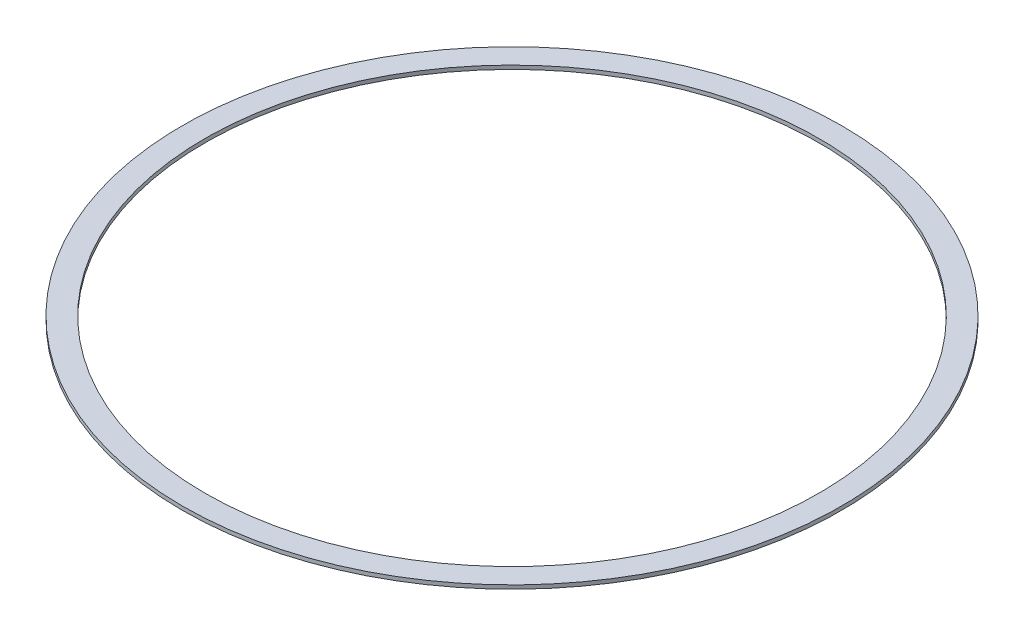
ISO-10303-21;
HEADER;
FILE_DESCRIPTION(('STEP AP214'),'2;1');
FILE_NAME('part.step','',(''),(''),'','','');
FILE_SCHEMA(('AUTOMOTIVE_DESIGN { 1 0 10303 214 1 1 1 1 }'));
ENDSEC;
DATA;
#1=APPLICATION_CONTEXT('core data for automotive mechanical design processes');
#2=APPLICATION_PROTOCOL_DEFINITION('international standard','automotive_design',2000,#1);
#3=PRODUCT_CONTEXT('',#1,'mechanical');
#4=PRODUCT('Part','Part','',(#3));
#5=PRODUCT_RELATED_PRODUCT_CATEGORY('part','',(#4));
#6=PRODUCT_DEFINITION_FORMATION('','',#4);
#7=PRODUCT_DEFINITION_CONTEXT('part definition',#1,'design');
#8=PRODUCT_DEFINITION('design','',#6,#7);
#9=PRODUCT_DEFINITION_SHAPE('','',#8);
#10=(LENGTH_UNIT() NAMED_UNIT(*) SI_UNIT(.MILLI.,.METRE.));
#11=(NAMED_UNIT(*) PLANE_ANGLE_UNIT() SI_UNIT($,.RADIAN.));
#12=(NAMED_UNIT(*) SI_UNIT($,.STERADIAN.) SOLID_ANGLE_UNIT());
#13=UNCERTAINTY_MEASURE_WITH_UNIT(LENGTH_MEASURE(1.E-05),#10,'distance_accuracy_value','');
#14=(GEOMETRIC_REPRESENTATION_CONTEXT(3) GLOBAL_UNCERTAINTY_ASSIGNED_CONTEXT((#13)) GLOBAL_UNIT_ASSIGNED_CONTEXT((#10,
#11,#12)) REPRESENTATION_CONTEXT('',''));
#15=CARTESIAN_POINT('',(0.,0.,0.));
#16=DIRECTION('',(0.,0.,1.));
#17=DIRECTION('',(1.,0.,0.));
#18=AXIS2_PLACEMENT_3D('',#15,#16,#17);
#19=CARTESIAN_POINT('',(0.,2.54,0.));
#20=DIRECTION('',(0.,1.,0.));
#21=DIRECTION('',(0.,0.,1.));
#22=AXIS2_PLACEMENT_3D('',#19,#20,#21);
#23=PLANE('',#22);
#24=CARTESIAN_POINT('',(0.,2.54,0.));
#25=DIRECTION('',(0.,1.,0.));
#26=DIRECTION('',(0.,0.,1.));
#27=AXIS2_PLACEMENT_3D('',#24,#25,#26);
#28=CIRCLE('',#27,221.9579);
#29=CARTESIAN_POINT('',(0.,2.54,221.9579));
#30=VERTEX_POINT('',#29);
#31=EDGE_CURVE('E10',#30,#30,#28,.T.);
#32=ORIENTED_EDGE('',*,*,#31,.T.);
#33=EDGE_LOOP('',(#32));
#34=FACE_BOUND('',#33,.T.);
#35=CARTESIAN_POINT('',(0.,2.54,0.));
#36=DIRECTION('',(0.,1.,0.));
#37=DIRECTION('',(0.,0.,1.));
#38=AXIS2_PLACEMENT_3D('',#35,#36,#37);
#39=CIRCLE('',#38,206.8449);
#40=CARTESIAN_POINT('',(0.,2.54,206.8449));
#41=VERTEX_POINT('',#40);
#42=EDGE_CURVE('E52',#41,#41,#39,.T.);
#43=ORIENTED_EDGE('',*,*,#42,.F.);
#44=EDGE_LOOP('',(#43));
#45=FACE_BOUND('',#44,.T.);
#46=ADVANCED_FACE('F41',(#34,#45),#23,.T.);
#47=CARTESIAN_POINT('',(0.,0.,0.));
#48=DIRECTION('',(0.,1.,0.));
#49=DIRECTION('',(0.,0.,1.));
#50=AXIS2_PLACEMENT_3D('',#47,#48,#49);
#51=PLANE('',#50);
#52=CARTESIAN_POINT('',(0.,0.,0.));
#53=DIRECTION('',(0.,1.,0.));
#54=DIRECTION('',(0.,0.,1.));
#55=AXIS2_PLACEMENT_3D('',#52,#53,#54);
#56=CIRCLE('',#55,221.9579);
#57=CARTESIAN_POINT('',(0.,0.,221.9579));
#58=VERTEX_POINT('',#57);
#59=EDGE_CURVE('E45',#58,#58,#56,.T.);
#60=ORIENTED_EDGE('',*,*,#59,.F.);
#61=EDGE_LOOP('',(#60));
#62=FACE_BOUND('',#61,.T.);
#63=CARTESIAN_POINT('',(0.,0.,0.));
#64=DIRECTION('',(0.,1.,0.));
#65=DIRECTION('',(0.,0.,1.));
#66=AXIS2_PLACEMENT_3D('',#63,#64,#65);
#67=CIRCLE('',#66,206.8449);
#68=CARTESIAN_POINT('',(0.,0.,206.8449));
#69=VERTEX_POINT('',#68);
#70=EDGE_CURVE('E54',#69,#69,#67,.T.);
#71=ORIENTED_EDGE('',*,*,#70,.T.);
#72=EDGE_LOOP('',(#71));
#73=FACE_BOUND('',#72,.T.);
#74=ADVANCED_FACE('F64',(#62,#73),#51,.F.);
#75=CARTESIAN_POINT('',(0.,2.54,0.));
#76=DIRECTION('',(0.,-1.,0.));
#77=DIRECTION('',(0.,0.,-1.));
#78=AXIS2_PLACEMENT_3D('',#75,#76,#77);
#79=CYLINDRICAL_SURFACE('',#78,221.9579);
#80=ORIENTED_EDGE('',*,*,#31,.F.);
#81=EDGE_LOOP('',(#80));
#82=FACE_BOUND('',#81,.T.);
#83=ORIENTED_EDGE('',*,*,#59,.T.);
#84=EDGE_LOOP('',(#83));
#85=FACE_BOUND('',#84,.T.);
#86=ADVANCED_FACE('F43',(#82,#85),#79,.T.);
#87=CARTESIAN_POINT('',(0.,2.54,0.));
#88=DIRECTION('',(0.,-1.,0.));
#89=DIRECTION('',(0.,0.,-1.));
#90=AXIS2_PLACEMENT_3D('',#87,#88,#89);
#91=CYLINDRICAL_SURFACE('',#90,206.8449);
#92=ORIENTED_EDGE('',*,*,#42,.T.);
#93=EDGE_LOOP('',(#92));
#94=FACE_BOUND('',#93,.T.);
#95=ORIENTED_EDGE('',*,*,#70,.F.);
#96=EDGE_LOOP('',(#95));
#97=FACE_BOUND('',#96,.T.);
#98=ADVANCED_FACE('F60',(#94,#97),#91,.F.);
#99=CLOSED_SHELL('',(#46,#74,#86,#98));
#100=MANIFOLD_SOLID_BREP('B2',#99);
#101=ADVANCED_BREP_SHAPE_REPRESENTATION('',(#18,#100),#14);
#102=SHAPE_DEFINITION_REPRESENTATION(#9,#101);
ENDSEC;
END-ISO-10303-21;
